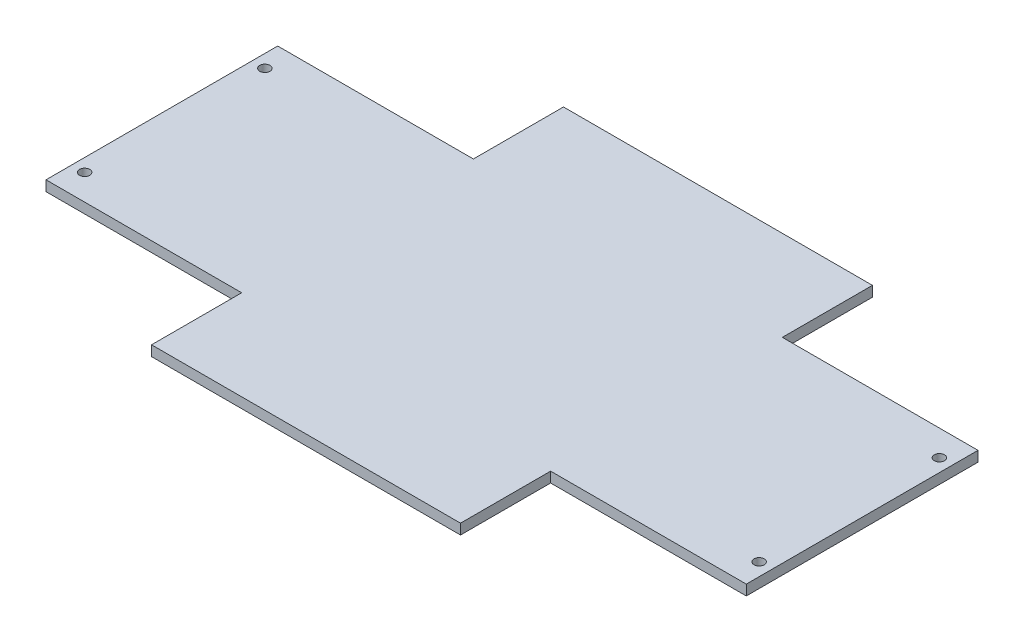
ISO-10303-21;
HEADER;
FILE_DESCRIPTION(('STEP AP214'),'2;1');
FILE_NAME('part.step','',(''),(''),'','','');
FILE_SCHEMA(('AUTOMOTIVE_DESIGN { 1 0 10303 214 1 1 1 1 }'));
ENDSEC;
DATA;
#1=APPLICATION_CONTEXT('core data for automotive mechanical design processes');
#2=APPLICATION_PROTOCOL_DEFINITION('international standard','automotive_design',2000,#1);
#3=PRODUCT_CONTEXT('',#1,'mechanical');
#4=PRODUCT('Part','Part','',(#3));
#5=PRODUCT_RELATED_PRODUCT_CATEGORY('part','',(#4));
#6=PRODUCT_DEFINITION_FORMATION('','',#4);
#7=PRODUCT_DEFINITION_CONTEXT('part definition',#1,'design');
#8=PRODUCT_DEFINITION('design','',#6,#7);
#9=PRODUCT_DEFINITION_SHAPE('','',#8);
#10=(LENGTH_UNIT() NAMED_UNIT(*) SI_UNIT(.MILLI.,.METRE.));
#11=(NAMED_UNIT(*) PLANE_ANGLE_UNIT() SI_UNIT($,.RADIAN.));
#12=(NAMED_UNIT(*) SI_UNIT($,.STERADIAN.) SOLID_ANGLE_UNIT());
#13=UNCERTAINTY_MEASURE_WITH_UNIT(LENGTH_MEASURE(1.E-05),#10,'distance_accuracy_value','');
#14=(GEOMETRIC_REPRESENTATION_CONTEXT(3) GLOBAL_UNCERTAINTY_ASSIGNED_CONTEXT((#13)) GLOBAL_UNIT_ASSIGNED_CONTEXT((#10,
#11,#12)) REPRESENTATION_CONTEXT('',''));
#15=CARTESIAN_POINT('',(0.,0.,0.));
#16=DIRECTION('',(0.,0.,1.));
#17=DIRECTION('',(1.,0.,0.));
#18=AXIS2_PLACEMENT_3D('',#15,#16,#17);
#19=CARTESIAN_POINT('',(0.,2.,0.));
#20=DIRECTION('',(1.,0.,0.));
#21=DIRECTION('',(0.,0.,-1.));
#22=AXIS2_PLACEMENT_3D('',#19,#20,#21);
#23=PLANE('',#22);
#24=DIRECTION('',(0.,0.,1.));
#25=VECTOR('',#24,1.);
#26=CARTESIAN_POINT('',(0.,0.,0.));
#27=LINE('',#26,#25);
#28=CARTESIAN_POINT('',(0.,0.,-45.));
#29=VERTEX_POINT('',#28);
#30=CARTESIAN_POINT('',(0.,0.,0.));
#31=VERTEX_POINT('',#30);
#32=EDGE_CURVE('E153',#29,#31,#27,.T.);
#33=ORIENTED_EDGE('',*,*,#32,.T.);
#34=DIRECTION('',(0.,-1.,0.));
#35=VECTOR('',#34,1.);
#36=CARTESIAN_POINT('',(0.,2.,0.));
#37=LINE('',#36,#35);
#38=CARTESIAN_POINT('',(0.,2.,0.));
#39=VERTEX_POINT('',#38);
#40=EDGE_CURVE('E11',#39,#31,#37,.T.);
#41=ORIENTED_EDGE('',*,*,#40,.F.);
#42=DIRECTION('',(0.,0.,1.));
#43=VECTOR('',#42,1.);
#44=CARTESIAN_POINT('',(0.,2.,0.));
#45=LINE('',#44,#43);
#46=CARTESIAN_POINT('',(0.,2.,-45.));
#47=VERTEX_POINT('',#46);
#48=EDGE_CURVE('E176',#47,#39,#45,.T.);
#49=ORIENTED_EDGE('',*,*,#48,.F.);
#50=DIRECTION('',(0.,-1.,0.));
#51=VECTOR('',#50,1.);
#52=CARTESIAN_POINT('',(0.,2.,-45.));
#53=LINE('',#52,#51);
#54=EDGE_CURVE('E149',#47,#29,#53,.T.);
#55=ORIENTED_EDGE('',*,*,#54,.T.);
#56=EDGE_LOOP('',(#33,#41,#49,#55));
#57=FACE_BOUND('',#56,.T.);
#58=ADVANCED_FACE('F33',(#57),#23,.F.);
#59=CARTESIAN_POINT('',(0.,2.,0.));
#60=DIRECTION('',(0.,0.,-1.));
#61=DIRECTION('',(-1.,0.,0.));
#62=AXIS2_PLACEMENT_3D('',#59,#60,#61);
#63=PLANE('',#62);
#64=DIRECTION('',(1.,0.,0.));
#65=VECTOR('',#64,1.);
#66=CARTESIAN_POINT('',(0.,0.,0.));
#67=LINE('',#66,#65);
#68=CARTESIAN_POINT('',(38.,0.,0.));
#69=VERTEX_POINT('',#68);
#70=EDGE_CURVE('E156',#31,#69,#67,.T.);
#71=ORIENTED_EDGE('',*,*,#70,.T.);
#72=DIRECTION('',(0.,-1.,0.));
#73=VECTOR('',#72,1.);
#74=CARTESIAN_POINT('',(38.,2.,0.));
#75=LINE('',#74,#73);
#76=CARTESIAN_POINT('',(38.,2.,0.));
#77=VERTEX_POINT('',#76);
#78=EDGE_CURVE('E41',#77,#69,#75,.T.);
#79=ORIENTED_EDGE('',*,*,#78,.F.);
#80=DIRECTION('',(1.,0.,0.));
#81=VECTOR('',#80,1.);
#82=CARTESIAN_POINT('',(0.,2.,0.));
#83=LINE('',#82,#81);
#84=EDGE_CURVE('E104',#39,#77,#83,.T.);
#85=ORIENTED_EDGE('',*,*,#84,.F.);
#86=ORIENTED_EDGE('',*,*,#40,.T.);
#87=EDGE_LOOP('',(#71,#79,#85,#86));
#88=FACE_BOUND('',#87,.T.);
#89=ADVANCED_FACE('F255',(#88),#63,.F.);
#90=CARTESIAN_POINT('',(38.,2.,0.));
#91=DIRECTION('',(1.,0.,0.));
#92=DIRECTION('',(0.,0.,-1.));
#93=AXIS2_PLACEMENT_3D('',#90,#91,#92);
#94=PLANE('',#93);
#95=DIRECTION('',(0.,0.,1.));
#96=VECTOR('',#95,1.);
#97=CARTESIAN_POINT('',(38.,0.,0.));
#98=LINE('',#97,#96);
#99=CARTESIAN_POINT('',(38.,0.,17.5));
#100=VERTEX_POINT('',#99);
#101=EDGE_CURVE('E159',#69,#100,#98,.T.);
#102=ORIENTED_EDGE('',*,*,#101,.T.);
#103=DIRECTION('',(0.,-1.,0.));
#104=VECTOR('',#103,1.);
#105=CARTESIAN_POINT('',(38.,2.,17.5));
#106=LINE('',#105,#104);
#107=CARTESIAN_POINT('',(38.,2.,17.5));
#108=VERTEX_POINT('',#107);
#109=EDGE_CURVE('E195',#108,#100,#106,.T.);
#110=ORIENTED_EDGE('',*,*,#109,.F.);
#111=DIRECTION('',(0.,0.,1.));
#112=VECTOR('',#111,1.);
#113=CARTESIAN_POINT('',(38.,2.,0.));
#114=LINE('',#113,#112);
#115=EDGE_CURVE('E203',#77,#108,#114,.T.);
#116=ORIENTED_EDGE('',*,*,#115,.F.);
#117=ORIENTED_EDGE('',*,*,#78,.T.);
#118=EDGE_LOOP('',(#102,#110,#116,#117));
#119=FACE_BOUND('',#118,.T.);
#120=ADVANCED_FACE('F201',(#119),#94,.F.);
#121=CARTESIAN_POINT('',(38.,2.,17.5));
#122=DIRECTION('',(0.,0.,-1.));
#123=DIRECTION('',(-1.,0.,0.));
#124=AXIS2_PLACEMENT_3D('',#121,#122,#123);
#125=PLANE('',#124);
#126=DIRECTION('',(1.,0.,0.));
#127=VECTOR('',#126,1.);
#128=CARTESIAN_POINT('',(38.,0.,17.5));
#129=LINE('',#128,#127);
#130=CARTESIAN_POINT('',(98.,0.,17.5));
#131=VERTEX_POINT('',#130);
#132=EDGE_CURVE('E161',#100,#131,#129,.T.);
#133=ORIENTED_EDGE('',*,*,#132,.T.);
#134=DIRECTION('',(0.,-1.,0.));
#135=VECTOR('',#134,1.);
#136=CARTESIAN_POINT('',(98.,2.,17.5));
#137=LINE('',#136,#135);
#138=CARTESIAN_POINT('',(98.,2.,17.5));
#139=VERTEX_POINT('',#138);
#140=EDGE_CURVE('E192',#139,#131,#137,.T.);
#141=ORIENTED_EDGE('',*,*,#140,.F.);
#142=DIRECTION('',(1.,0.,0.));
#143=VECTOR('',#142,1.);
#144=CARTESIAN_POINT('',(38.,2.,17.5));
#145=LINE('',#144,#143);
#146=EDGE_CURVE('E221',#108,#139,#145,.T.);
#147=ORIENTED_EDGE('',*,*,#146,.F.);
#148=ORIENTED_EDGE('',*,*,#109,.T.);
#149=EDGE_LOOP('',(#133,#141,#147,#148));
#150=FACE_BOUND('',#149,.T.);
#151=ADVANCED_FACE('F212',(#150),#125,.F.);
#152=CARTESIAN_POINT('',(98.,2.,0.));
#153=DIRECTION('',(-1.,0.,0.));
#154=DIRECTION('',(0.,0.,1.));
#155=AXIS2_PLACEMENT_3D('',#152,#153,#154);
#156=PLANE('',#155);
#157=DIRECTION('',(0.,0.,-1.));
#158=VECTOR('',#157,1.);
#159=CARTESIAN_POINT('',(98.,0.,0.));
#160=LINE('',#159,#158);
#161=CARTESIAN_POINT('',(98.,0.,0.));
#162=VERTEX_POINT('',#161);
#163=EDGE_CURVE('E163',#131,#162,#160,.T.);
#164=ORIENTED_EDGE('',*,*,#163,.T.);
#165=DIRECTION('',(0.,-1.,0.));
#166=VECTOR('',#165,1.);
#167=CARTESIAN_POINT('',(98.,2.,0.));
#168=LINE('',#167,#166);
#169=CARTESIAN_POINT('',(98.,2.,0.));
#170=VERTEX_POINT('',#169);
#171=EDGE_CURVE('E189',#170,#162,#168,.T.);
#172=ORIENTED_EDGE('',*,*,#171,.F.);
#173=DIRECTION('',(0.,0.,-1.));
#174=VECTOR('',#173,1.);
#175=CARTESIAN_POINT('',(98.,2.,0.));
#176=LINE('',#175,#174);
#177=EDGE_CURVE('E218',#139,#170,#176,.T.);
#178=ORIENTED_EDGE('',*,*,#177,.F.);
#179=ORIENTED_EDGE('',*,*,#140,.T.);
#180=EDGE_LOOP('',(#164,#172,#178,#179));
#181=FACE_BOUND('',#180,.T.);
#182=ADVANCED_FACE('F216',(#181),#156,.F.);
#183=CARTESIAN_POINT('',(98.,2.,0.));
#184=DIRECTION('',(0.,0.,-1.));
#185=DIRECTION('',(-1.,0.,0.));
#186=AXIS2_PLACEMENT_3D('',#183,#184,#185);
#187=PLANE('',#186);
#188=DIRECTION('',(1.,0.,0.));
#189=VECTOR('',#188,1.);
#190=CARTESIAN_POINT('',(98.,0.,0.));
#191=LINE('',#190,#189);
#192=CARTESIAN_POINT('',(136.,0.,0.));
#193=VERTEX_POINT('',#192);
#194=EDGE_CURVE('E165',#162,#193,#191,.T.);
#195=ORIENTED_EDGE('',*,*,#194,.T.);
#196=DIRECTION('',(0.,-1.,0.));
#197=VECTOR('',#196,1.);
#198=CARTESIAN_POINT('',(136.,2.,0.));
#199=LINE('',#198,#197);
#200=CARTESIAN_POINT('',(136.,2.,0.));
#201=VERTEX_POINT('',#200);
#202=EDGE_CURVE('E186',#201,#193,#199,.T.);
#203=ORIENTED_EDGE('',*,*,#202,.F.);
#204=DIRECTION('',(1.,0.,0.));
#205=VECTOR('',#204,1.);
#206=CARTESIAN_POINT('',(98.,2.,0.));
#207=LINE('',#206,#205);
#208=EDGE_CURVE('E220',#170,#201,#207,.T.);
#209=ORIENTED_EDGE('',*,*,#208,.F.);
#210=ORIENTED_EDGE('',*,*,#171,.T.);
#211=EDGE_LOOP('',(#195,#203,#209,#210));
#212=FACE_BOUND('',#211,.T.);
#213=ADVANCED_FACE('F268',(#212),#187,.F.);
#214=CARTESIAN_POINT('',(136.,2.,0.));
#215=DIRECTION('',(-1.,0.,0.));
#216=DIRECTION('',(0.,0.,1.));
#217=AXIS2_PLACEMENT_3D('',#214,#215,#216);
#218=PLANE('',#217);
#219=DIRECTION('',(0.,0.,-1.));
#220=VECTOR('',#219,1.);
#221=CARTESIAN_POINT('',(136.,0.,0.));
#222=LINE('',#221,#220);
#223=CARTESIAN_POINT('',(136.,0.,-45.));
#224=VERTEX_POINT('',#223);
#225=EDGE_CURVE('E167',#193,#224,#222,.T.);
#226=ORIENTED_EDGE('',*,*,#225,.T.);
#227=DIRECTION('',(0.,-1.,0.));
#228=VECTOR('',#227,1.);
#229=CARTESIAN_POINT('',(136.,2.,-45.));
#230=LINE('',#229,#228);
#231=CARTESIAN_POINT('',(136.,2.,-45.));
#232=VERTEX_POINT('',#231);
#233=EDGE_CURVE('E183',#232,#224,#230,.T.);
#234=ORIENTED_EDGE('',*,*,#233,.F.);
#235=DIRECTION('',(0.,0.,-1.));
#236=VECTOR('',#235,1.);
#237=CARTESIAN_POINT('',(136.,2.,0.));
#238=LINE('',#237,#236);
#239=EDGE_CURVE('E223',#201,#232,#238,.T.);
#240=ORIENTED_EDGE('',*,*,#239,.F.);
#241=ORIENTED_EDGE('',*,*,#202,.T.);
#242=EDGE_LOOP('',(#226,#234,#240,#241));
#243=FACE_BOUND('',#242,.T.);
#244=ADVANCED_FACE('F271',(#243),#218,.F.);
#245=CARTESIAN_POINT('',(98.,2.,-45.));
#246=DIRECTION('',(0.,0.,1.));
#247=DIRECTION('',(1.,0.,0.));
#248=AXIS2_PLACEMENT_3D('',#245,#246,#247);
#249=PLANE('',#248);
#250=DIRECTION('',(-1.,0.,0.));
#251=VECTOR('',#250,1.);
#252=CARTESIAN_POINT('',(98.,0.,-45.));
#253=LINE('',#252,#251);
#254=CARTESIAN_POINT('',(98.,0.,-45.));
#255=VERTEX_POINT('',#254);
#256=EDGE_CURVE('E169',#224,#255,#253,.T.);
#257=ORIENTED_EDGE('',*,*,#256,.T.);
#258=DIRECTION('',(0.,-1.,0.));
#259=VECTOR('',#258,1.);
#260=CARTESIAN_POINT('',(98.,2.,-45.));
#261=LINE('',#260,#259);
#262=CARTESIAN_POINT('',(98.,2.,-45.));
#263=VERTEX_POINT('',#262);
#264=EDGE_CURVE('E180',#263,#255,#261,.T.);
#265=ORIENTED_EDGE('',*,*,#264,.F.);
#266=DIRECTION('',(-1.,0.,0.));
#267=VECTOR('',#266,1.);
#268=CARTESIAN_POINT('',(98.,2.,-45.));
#269=LINE('',#268,#267);
#270=EDGE_CURVE('E229',#232,#263,#269,.T.);
#271=ORIENTED_EDGE('',*,*,#270,.F.);
#272=ORIENTED_EDGE('',*,*,#233,.T.);
#273=EDGE_LOOP('',(#257,#265,#271,#272));
#274=FACE_BOUND('',#273,.T.);
#275=ADVANCED_FACE('F235',(#274),#249,.F.);
#276=CARTESIAN_POINT('',(98.,2.,-45.));
#277=DIRECTION('',(-1.,0.,0.));
#278=DIRECTION('',(0.,0.,1.));
#279=AXIS2_PLACEMENT_3D('',#276,#277,#278);
#280=PLANE('',#279);
#281=DIRECTION('',(0.,0.,-1.));
#282=VECTOR('',#281,1.);
#283=CARTESIAN_POINT('',(98.,0.,-45.));
#284=LINE('',#283,#282);
#285=CARTESIAN_POINT('',(98.,0.,-62.5));
#286=VERTEX_POINT('',#285);
#287=EDGE_CURVE('E171',#255,#286,#284,.T.);
#288=ORIENTED_EDGE('',*,*,#287,.T.);
#289=DIRECTION('',(0.,-1.,0.));
#290=VECTOR('',#289,1.);
#291=CARTESIAN_POINT('',(98.,2.,-62.5));
#292=LINE('',#291,#290);
#293=CARTESIAN_POINT('',(98.,2.,-62.5));
#294=VERTEX_POINT('',#293);
#295=EDGE_CURVE('E144',#294,#286,#292,.T.);
#296=ORIENTED_EDGE('',*,*,#295,.F.);
#297=DIRECTION('',(0.,0.,-1.));
#298=VECTOR('',#297,1.);
#299=CARTESIAN_POINT('',(98.,2.,-45.));
#300=LINE('',#299,#298);
#301=EDGE_CURVE('E135',#263,#294,#300,.T.);
#302=ORIENTED_EDGE('',*,*,#301,.F.);
#303=ORIENTED_EDGE('',*,*,#264,.T.);
#304=EDGE_LOOP('',(#288,#296,#302,#303));
#305=FACE_BOUND('',#304,.T.);
#306=ADVANCED_FACE('F239',(#305),#280,.F.);
#307=CARTESIAN_POINT('',(38.,2.,-62.5));
#308=DIRECTION('',(0.,0.,1.));
#309=DIRECTION('',(1.,0.,0.));
#310=AXIS2_PLACEMENT_3D('',#307,#308,#309);
#311=PLANE('',#310);
#312=DIRECTION('',(-1.,0.,0.));
#313=VECTOR('',#312,1.);
#314=CARTESIAN_POINT('',(38.,0.,-62.5));
#315=LINE('',#314,#313);
#316=CARTESIAN_POINT('',(38.,0.,-62.5));
#317=VERTEX_POINT('',#316);
#318=EDGE_CURVE('E143',#286,#317,#315,.T.);
#319=ORIENTED_EDGE('',*,*,#318,.T.);
#320=DIRECTION('',(0.,-1.,0.));
#321=VECTOR('',#320,1.);
#322=CARTESIAN_POINT('',(38.,2.,-62.5));
#323=LINE('',#322,#321);
#324=CARTESIAN_POINT('',(38.,2.,-62.5));
#325=VERTEX_POINT('',#324);
#326=EDGE_CURVE('E140',#325,#317,#323,.T.);
#327=ORIENTED_EDGE('',*,*,#326,.F.);
#328=DIRECTION('',(-1.,0.,0.));
#329=VECTOR('',#328,1.);
#330=CARTESIAN_POINT('',(38.,2.,-62.5));
#331=LINE('',#330,#329);
#332=EDGE_CURVE('E129',#294,#325,#331,.T.);
#333=ORIENTED_EDGE('',*,*,#332,.F.);
#334=ORIENTED_EDGE('',*,*,#295,.T.);
#335=EDGE_LOOP('',(#319,#327,#333,#334));
#336=FACE_BOUND('',#335,.T.);
#337=ADVANCED_FACE('F141',(#336),#311,.F.);
#338=CARTESIAN_POINT('',(38.,2.,-45.));
#339=DIRECTION('',(1.,0.,0.));
#340=DIRECTION('',(0.,0.,-1.));
#341=AXIS2_PLACEMENT_3D('',#338,#339,#340);
#342=PLANE('',#341);
#343=DIRECTION('',(0.,0.,1.));
#344=VECTOR('',#343,1.);
#345=CARTESIAN_POINT('',(38.,0.,-45.));
#346=LINE('',#345,#344);
#347=CARTESIAN_POINT('',(38.,0.,-45.));
#348=VERTEX_POINT('',#347);
#349=EDGE_CURVE('E90',#317,#348,#346,.T.);
#350=ORIENTED_EDGE('',*,*,#349,.T.);
#351=DIRECTION('',(0.,-1.,0.));
#352=VECTOR('',#351,1.);
#353=CARTESIAN_POINT('',(38.,2.,-45.));
#354=LINE('',#353,#352);
#355=CARTESIAN_POINT('',(38.,2.,-45.));
#356=VERTEX_POINT('',#355);
#357=EDGE_CURVE('E145',#356,#348,#354,.T.);
#358=ORIENTED_EDGE('',*,*,#357,.F.);
#359=DIRECTION('',(0.,0.,1.));
#360=VECTOR('',#359,1.);
#361=CARTESIAN_POINT('',(38.,2.,-45.));
#362=LINE('',#361,#360);
#363=EDGE_CURVE('E133',#325,#356,#362,.T.);
#364=ORIENTED_EDGE('',*,*,#363,.F.);
#365=ORIENTED_EDGE('',*,*,#326,.T.);
#366=EDGE_LOOP('',(#350,#358,#364,#365));
#367=FACE_BOUND('',#366,.T.);
#368=ADVANCED_FACE('F147',(#367),#342,.F.);
#369=CARTESIAN_POINT('',(0.,2.,-45.));
#370=DIRECTION('',(0.,0.,1.));
#371=DIRECTION('',(1.,0.,0.));
#372=AXIS2_PLACEMENT_3D('',#369,#370,#371);
#373=PLANE('',#372);
#374=DIRECTION('',(-1.,0.,0.));
#375=VECTOR('',#374,1.);
#376=CARTESIAN_POINT('',(0.,0.,-45.));
#377=LINE('',#376,#375);
#378=EDGE_CURVE('E96',#348,#29,#377,.T.);
#379=ORIENTED_EDGE('',*,*,#378,.T.);
#380=ORIENTED_EDGE('',*,*,#54,.F.);
#381=DIRECTION('',(-1.,0.,0.));
#382=VECTOR('',#381,1.);
#383=CARTESIAN_POINT('',(0.,2.,-45.));
#384=LINE('',#383,#382);
#385=EDGE_CURVE('E49',#356,#47,#384,.T.);
#386=ORIENTED_EDGE('',*,*,#385,.F.);
#387=ORIENTED_EDGE('',*,*,#357,.T.);
#388=EDGE_LOOP('',(#379,#380,#386,#387));
#389=FACE_BOUND('',#388,.T.);
#390=ADVANCED_FACE('F243',(#389),#373,.F.);
#391=CARTESIAN_POINT('',(0.,2.,0.));
#392=DIRECTION('',(0.,-1.,0.));
#393=DIRECTION('',(0.,0.,-1.));
#394=AXIS2_PLACEMENT_3D('',#391,#392,#393);
#395=PLANE('',#394);
#396=CARTESIAN_POINT('',(2.5,2.,-5.));
#397=DIRECTION('',(0.,1.,0.));
#398=DIRECTION('',(0.,0.,1.));
#399=AXIS2_PLACEMENT_3D('',#396,#397,#398);
#400=CIRCLE('',#399,1.);
#401=CARTESIAN_POINT('',(2.5,2.,-4.));
#402=VERTEX_POINT('',#401);
#403=EDGE_CURVE('E357',#402,#402,#400,.T.);
#404=ORIENTED_EDGE('',*,*,#403,.F.);
#405=EDGE_LOOP('',(#404));
#406=FACE_BOUND('',#405,.T.);
#407=CARTESIAN_POINT('',(2.5,2.,-40.));
#408=DIRECTION('',(0.,1.,0.));
#409=DIRECTION('',(0.,0.,1.));
#410=AXIS2_PLACEMENT_3D('',#407,#408,#409);
#411=CIRCLE('',#410,1.);
#412=CARTESIAN_POINT('',(2.5,2.,-39.));
#413=VERTEX_POINT('',#412);
#414=EDGE_CURVE('E359',#413,#413,#411,.T.);
#415=ORIENTED_EDGE('',*,*,#414,.F.);
#416=EDGE_LOOP('',(#415));
#417=FACE_BOUND('',#416,.T.);
#418=CARTESIAN_POINT('',(133.5,2.,-40.));
#419=DIRECTION('',(0.,1.,0.));
#420=DIRECTION('',(0.,0.,1.));
#421=AXIS2_PLACEMENT_3D('',#418,#419,#420);
#422=CIRCLE('',#421,1.);
#423=CARTESIAN_POINT('',(133.5,2.,-39.));
#424=VERTEX_POINT('',#423);
#425=EDGE_CURVE('E367',#424,#424,#422,.T.);
#426=ORIENTED_EDGE('',*,*,#425,.F.);
#427=EDGE_LOOP('',(#426));
#428=FACE_BOUND('',#427,.T.);
#429=CARTESIAN_POINT('',(133.5,2.,-5.));
#430=DIRECTION('',(0.,1.,0.));
#431=DIRECTION('',(0.,0.,1.));
#432=AXIS2_PLACEMENT_3D('',#429,#430,#431);
#433=CIRCLE('',#432,1.);
#434=CARTESIAN_POINT('',(133.5,2.,-4.));
#435=VERTEX_POINT('',#434);
#436=EDGE_CURVE('E373',#435,#435,#433,.T.);
#437=ORIENTED_EDGE('',*,*,#436,.F.);
#438=EDGE_LOOP('',(#437));
#439=FACE_BOUND('',#438,.T.);
#440=ORIENTED_EDGE('',*,*,#48,.T.);
#441=ORIENTED_EDGE('',*,*,#84,.T.);
#442=ORIENTED_EDGE('',*,*,#115,.T.);
#443=ORIENTED_EDGE('',*,*,#146,.T.);
#444=ORIENTED_EDGE('',*,*,#177,.T.);
#445=ORIENTED_EDGE('',*,*,#208,.T.);
#446=ORIENTED_EDGE('',*,*,#239,.T.);
#447=ORIENTED_EDGE('',*,*,#270,.T.);
#448=ORIENTED_EDGE('',*,*,#301,.T.);
#449=ORIENTED_EDGE('',*,*,#332,.T.);
#450=ORIENTED_EDGE('',*,*,#363,.T.);
#451=ORIENTED_EDGE('',*,*,#385,.T.);
#452=EDGE_LOOP('',(#440,#441,#442,#443,#444,#445,#446,#447,#448,#449,#450,#451));
#453=FACE_BOUND('',#452,.T.);
#454=ADVANCED_FACE('F131',(#406,#417,#428,#439,#453),#395,.F.);
#455=CARTESIAN_POINT('',(0.,0.,0.));
#456=DIRECTION('',(0.,-1.,0.));
#457=DIRECTION('',(0.,0.,-1.));
#458=AXIS2_PLACEMENT_3D('',#455,#456,#457);
#459=PLANE('',#458);
#460=CARTESIAN_POINT('',(2.5,0.,-5.));
#461=DIRECTION('',(0.,1.,0.));
#462=DIRECTION('',(0.,0.,1.));
#463=AXIS2_PLACEMENT_3D('',#460,#461,#462);
#464=CIRCLE('',#463,1.);
#465=CARTESIAN_POINT('',(2.5,0.,-4.));
#466=VERTEX_POINT('',#465);
#467=EDGE_CURVE('E354',#466,#466,#464,.T.);
#468=ORIENTED_EDGE('',*,*,#467,.T.);
#469=EDGE_LOOP('',(#468));
#470=FACE_BOUND('',#469,.T.);
#471=CARTESIAN_POINT('',(2.5,0.,-40.));
#472=DIRECTION('',(0.,1.,0.));
#473=DIRECTION('',(0.,0.,1.));
#474=AXIS2_PLACEMENT_3D('',#471,#472,#473);
#475=CIRCLE('',#474,1.);
#476=CARTESIAN_POINT('',(2.5,0.,-39.));
#477=VERTEX_POINT('',#476);
#478=EDGE_CURVE('E364',#477,#477,#475,.T.);
#479=ORIENTED_EDGE('',*,*,#478,.T.);
#480=EDGE_LOOP('',(#479));
#481=FACE_BOUND('',#480,.T.);
#482=CARTESIAN_POINT('',(133.5,0.,-40.));
#483=DIRECTION('',(0.,1.,0.));
#484=DIRECTION('',(0.,0.,1.));
#485=AXIS2_PLACEMENT_3D('',#482,#483,#484);
#486=CIRCLE('',#485,1.);
#487=CARTESIAN_POINT('',(133.5,0.,-39.));
#488=VERTEX_POINT('',#487);
#489=EDGE_CURVE('E370',#488,#488,#486,.T.);
#490=ORIENTED_EDGE('',*,*,#489,.T.);
#491=EDGE_LOOP('',(#490));
#492=FACE_BOUND('',#491,.T.);
#493=CARTESIAN_POINT('',(133.5,0.,-5.));
#494=DIRECTION('',(0.,1.,0.));
#495=DIRECTION('',(0.,0.,1.));
#496=AXIS2_PLACEMENT_3D('',#493,#494,#495);
#497=CIRCLE('',#496,1.);
#498=CARTESIAN_POINT('',(133.5,0.,-4.));
#499=VERTEX_POINT('',#498);
#500=EDGE_CURVE('E157',#499,#499,#497,.T.);
#501=ORIENTED_EDGE('',*,*,#500,.T.);
#502=EDGE_LOOP('',(#501));
#503=FACE_BOUND('',#502,.T.);
#504=ORIENTED_EDGE('',*,*,#32,.F.);
#505=ORIENTED_EDGE('',*,*,#378,.F.);
#506=ORIENTED_EDGE('',*,*,#349,.F.);
#507=ORIENTED_EDGE('',*,*,#318,.F.);
#508=ORIENTED_EDGE('',*,*,#287,.F.);
#509=ORIENTED_EDGE('',*,*,#256,.F.);
#510=ORIENTED_EDGE('',*,*,#225,.F.);
#511=ORIENTED_EDGE('',*,*,#194,.F.);
#512=ORIENTED_EDGE('',*,*,#163,.F.);
#513=ORIENTED_EDGE('',*,*,#132,.F.);
#514=ORIENTED_EDGE('',*,*,#101,.F.);
#515=ORIENTED_EDGE('',*,*,#70,.F.);
#516=EDGE_LOOP('',(#504,#505,#506,#507,#508,#509,#510,#511,#512,#513,#514,#515));
#517=FACE_BOUND('',#516,.T.);
#518=ADVANCED_FACE('F207',(#470,#481,#492,#503,#517),#459,.T.);
#519=CARTESIAN_POINT('',(133.5,2.,-5.));
#520=DIRECTION('',(0.,1.,0.));
#521=DIRECTION('',(0.,0.,1.));
#522=AXIS2_PLACEMENT_3D('',#519,#520,#521);
#523=CYLINDRICAL_SURFACE('',#522,1.);
#524=ORIENTED_EDGE('',*,*,#500,.F.);
#525=EDGE_LOOP('',(#524));
#526=FACE_BOUND('',#525,.T.);
#527=ORIENTED_EDGE('',*,*,#436,.T.);
#528=EDGE_LOOP('',(#527));
#529=FACE_BOUND('',#528,.T.);
#530=ADVANCED_FACE('F308',(#526,#529),#523,.F.);
#531=CARTESIAN_POINT('',(133.5,2.,-40.));
#532=DIRECTION('',(0.,1.,0.));
#533=DIRECTION('',(0.,0.,1.));
#534=AXIS2_PLACEMENT_3D('',#531,#532,#533);
#535=CYLINDRICAL_SURFACE('',#534,1.);
#536=ORIENTED_EDGE('',*,*,#489,.F.);
#537=EDGE_LOOP('',(#536));
#538=FACE_BOUND('',#537,.T.);
#539=ORIENTED_EDGE('',*,*,#425,.T.);
#540=EDGE_LOOP('',(#539));
#541=FACE_BOUND('',#540,.T.);
#542=ADVANCED_FACE('F317',(#538,#541),#535,.F.);
#543=CARTESIAN_POINT('',(2.5,2.,-40.));
#544=DIRECTION('',(0.,1.,0.));
#545=DIRECTION('',(0.,0.,1.));
#546=AXIS2_PLACEMENT_3D('',#543,#544,#545);
#547=CYLINDRICAL_SURFACE('',#546,1.);
#548=ORIENTED_EDGE('',*,*,#478,.F.);
#549=EDGE_LOOP('',(#548));
#550=FACE_BOUND('',#549,.T.);
#551=ORIENTED_EDGE('',*,*,#414,.T.);
#552=EDGE_LOOP('',(#551));
#553=FACE_BOUND('',#552,.T.);
#554=ADVANCED_FACE('F327',(#550,#553),#547,.F.);
#555=CARTESIAN_POINT('',(2.5,2.,-5.));
#556=DIRECTION('',(0.,1.,0.));
#557=DIRECTION('',(0.,0.,1.));
#558=AXIS2_PLACEMENT_3D('',#555,#556,#557);
#559=CYLINDRICAL_SURFACE('',#558,1.);
#560=ORIENTED_EDGE('',*,*,#467,.F.);
#561=EDGE_LOOP('',(#560));
#562=FACE_BOUND('',#561,.T.);
#563=ORIENTED_EDGE('',*,*,#403,.T.);
#564=EDGE_LOOP('',(#563));
#565=FACE_BOUND('',#564,.T.);
#566=ADVANCED_FACE('F337',(#562,#565),#559,.F.);
#567=CLOSED_SHELL('',(#58,#89,#120,#151,#182,#213,#244,#275,#306,#337,#368,#390,#454,#518,#530,
#542,#554,#566));
#568=MANIFOLD_SOLID_BREP('B2',#567);
#569=ADVANCED_BREP_SHAPE_REPRESENTATION('',(#18,#568),#14);
#570=SHAPE_DEFINITION_REPRESENTATION(#9,#569);
ENDSEC;
END-ISO-10303-21;
